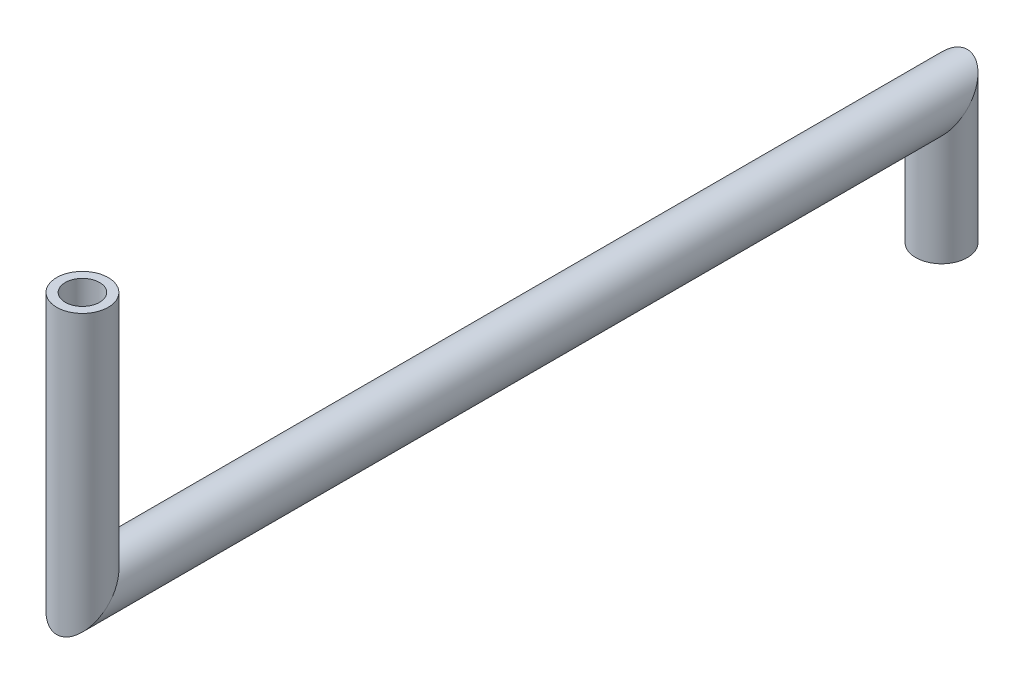
ISO-10303-21;
HEADER;
FILE_DESCRIPTION(('STEP AP214'),'2;1');
FILE_NAME('part.step','',(''),(''),'','','');
FILE_SCHEMA(('AUTOMOTIVE_DESIGN { 1 0 10303 214 1 1 1 1 }'));
ENDSEC;
DATA;
#1=APPLICATION_CONTEXT('core data for automotive mechanical design processes');
#2=APPLICATION_PROTOCOL_DEFINITION('international standard','automotive_design',2000,#1);
#3=PRODUCT_CONTEXT('',#1,'mechanical');
#4=PRODUCT('Part','Part','',(#3));
#5=PRODUCT_RELATED_PRODUCT_CATEGORY('part','',(#4));
#6=PRODUCT_DEFINITION_FORMATION('','',#4);
#7=PRODUCT_DEFINITION_CONTEXT('part definition',#1,'design');
#8=PRODUCT_DEFINITION('design','',#6,#7);
#9=PRODUCT_DEFINITION_SHAPE('','',#8);
#10=(LENGTH_UNIT() NAMED_UNIT(*) SI_UNIT(.MILLI.,.METRE.));
#11=(NAMED_UNIT(*) PLANE_ANGLE_UNIT() SI_UNIT($,.RADIAN.));
#12=(NAMED_UNIT(*) SI_UNIT($,.STERADIAN.) SOLID_ANGLE_UNIT());
#13=UNCERTAINTY_MEASURE_WITH_UNIT(LENGTH_MEASURE(1.E-05),#10,'distance_accuracy_value','');
#14=(GEOMETRIC_REPRESENTATION_CONTEXT(3) GLOBAL_UNCERTAINTY_ASSIGNED_CONTEXT((#13)) GLOBAL_UNIT_ASSIGNED_CONTEXT((#10,
#11,#12)) REPRESENTATION_CONTEXT('',''));
#15=CARTESIAN_POINT('',(0.,0.,0.));
#16=DIRECTION('',(0.,0.,1.));
#17=DIRECTION('',(1.,0.,0.));
#18=AXIS2_PLACEMENT_3D('',#15,#16,#17);
#19=CARTESIAN_POINT('',(0.,233.9,2000.));
#20=DIRECTION('',(0.,1.,0.));
#21=DIRECTION('',(0.,0.,1.));
#22=AXIS2_PLACEMENT_3D('',#19,#20,#21);
#23=CYLINDRICAL_SURFACE('',#22,60.);
#24=CARTESIAN_POINT('',(0.,300.,2000.));
#25=DIRECTION('',(0.,0.707106781186547,0.707106781186548));
#26=DIRECTION('',(0.,-0.707106781186548,0.707106781186547));
#27=AXIS2_PLACEMENT_3D('',#24,#25,#26);
#28=ELLIPSE('',#27,84.8528137423857,60.);
#29=CARTESIAN_POINT('',(0.,240.,2060.));
#30=VERTEX_POINT('',#29);
#31=EDGE_CURVE('E36',#30,#30,#28,.F.);
#32=ORIENTED_EDGE('',*,*,#31,.F.);
#33=EDGE_LOOP('',(#32));
#34=FACE_BOUND('',#33,.T.);
#35=CARTESIAN_POINT('',(0.,900.,2000.));
#36=DIRECTION('',(0.,1.,0.));
#37=DIRECTION('',(0.,0.,1.));
#38=AXIS2_PLACEMENT_3D('',#35,#36,#37);
#39=CIRCLE('',#38,60.);
#40=CARTESIAN_POINT('',(0.,900.,2060.));
#41=VERTEX_POINT('',#40);
#42=EDGE_CURVE('E47',#41,#41,#39,.T.);
#43=ORIENTED_EDGE('',*,*,#42,.F.);
#44=EDGE_LOOP('',(#43));
#45=FACE_BOUND('',#44,.T.);
#46=ADVANCED_FACE('F33',(#34,#45),#23,.T.);
#47=CARTESIAN_POINT('',(0.,300.,-66.1));
#48=DIRECTION('',(0.,0.,1.));
#49=DIRECTION('',(0.,-1.,0.));
#50=AXIS2_PLACEMENT_3D('',#47,#48,#49);
#51=CYLINDRICAL_SURFACE('',#50,60.);
#52=CARTESIAN_POINT('',(0.,300.,0.));
#53=DIRECTION('',(0.,0.707106781186548,0.707106781186548));
#54=DIRECTION('',(0.,0.707106781186548,-0.707106781186548));
#55=AXIS2_PLACEMENT_3D('',#52,#53,#54);
#56=ELLIPSE('',#55,84.8528137423857,60.);
#57=CARTESIAN_POINT('',(0.,360.,-60.));
#58=VERTEX_POINT('',#57);
#59=EDGE_CURVE('E86',#58,#58,#56,.F.);
#60=ORIENTED_EDGE('',*,*,#59,.F.);
#61=EDGE_LOOP('',(#60));
#62=FACE_BOUND('',#61,.T.);
#63=ORIENTED_EDGE('',*,*,#31,.T.);
#64=EDGE_LOOP('',(#63));
#65=FACE_BOUND('',#64,.T.);
#66=ADVANCED_FACE('F90',(#62,#65),#51,.T.);
#67=CARTESIAN_POINT('',(0.,0.,0.));
#68=DIRECTION('',(0.,1.,0.));
#69=DIRECTION('',(0.,0.,1.));
#70=AXIS2_PLACEMENT_3D('',#67,#68,#69);
#71=CYLINDRICAL_SURFACE('',#70,60.);
#72=CARTESIAN_POINT('',(0.,0.,0.));
#73=DIRECTION('',(0.,1.,0.));
#74=DIRECTION('',(0.,0.,1.));
#75=AXIS2_PLACEMENT_3D('',#72,#73,#74);
#76=CIRCLE('',#75,60.);
#77=CARTESIAN_POINT('',(0.,0.,60.));
#78=VERTEX_POINT('',#77);
#79=EDGE_CURVE('E53',#78,#78,#76,.T.);
#80=ORIENTED_EDGE('',*,*,#79,.T.);
#81=EDGE_LOOP('',(#80));
#82=FACE_BOUND('',#81,.T.);
#83=ORIENTED_EDGE('',*,*,#59,.T.);
#84=EDGE_LOOP('',(#83));
#85=FACE_BOUND('',#84,.T.);
#86=ADVANCED_FACE('F92',(#82,#85),#71,.T.);
#87=CARTESIAN_POINT('',(0.,900.,2000.));
#88=DIRECTION('',(0.,1.,0.));
#89=DIRECTION('',(0.,0.,1.));
#90=AXIS2_PLACEMENT_3D('',#87,#88,#89);
#91=PLANE('',#90);
#92=CARTESIAN_POINT('',(0.,900.,2000.));
#93=DIRECTION('',(0.,1.,0.));
#94=DIRECTION('',(0.,0.,1.));
#95=AXIS2_PLACEMENT_3D('',#92,#93,#94);
#96=CIRCLE('',#95,40.);
#97=CARTESIAN_POINT('',(0.,900.,2040.));
#98=VERTEX_POINT('',#97);
#99=EDGE_CURVE('E79',#98,#98,#96,.F.);
#100=ORIENTED_EDGE('',*,*,#99,.T.);
#101=EDGE_LOOP('',(#100));
#102=FACE_BOUND('',#101,.T.);
#103=ORIENTED_EDGE('',*,*,#42,.T.);
#104=EDGE_LOOP('',(#103));
#105=FACE_BOUND('',#104,.T.);
#106=ADVANCED_FACE('F98',(#102,#105),#91,.T.);
#107=CARTESIAN_POINT('',(0.,0.,0.));
#108=DIRECTION('',(0.,1.,0.));
#109=DIRECTION('',(0.,0.,1.));
#110=AXIS2_PLACEMENT_3D('',#107,#108,#109);
#111=PLANE('',#110);
#112=CARTESIAN_POINT('',(0.,0.,0.));
#113=DIRECTION('',(0.,1.,0.));
#114=DIRECTION('',(0.,0.,1.));
#115=AXIS2_PLACEMENT_3D('',#112,#113,#114);
#116=CIRCLE('',#115,40.);
#117=CARTESIAN_POINT('',(0.,0.,40.));
#118=VERTEX_POINT('',#117);
#119=EDGE_CURVE('E41',#118,#118,#116,.F.);
#120=ORIENTED_EDGE('',*,*,#119,.F.);
#121=EDGE_LOOP('',(#120));
#122=FACE_BOUND('',#121,.T.);
#123=ORIENTED_EDGE('',*,*,#79,.F.);
#124=EDGE_LOOP('',(#123));
#125=FACE_BOUND('',#124,.T.);
#126=ADVANCED_FACE('F113',(#122,#125),#111,.F.);
#127=CARTESIAN_POINT('',(0.,255.9,2000.));
#128=DIRECTION('',(0.,1.,0.));
#129=DIRECTION('',(0.,0.,1.));
#130=AXIS2_PLACEMENT_3D('',#127,#128,#129);
#131=CYLINDRICAL_SURFACE('',#130,40.);
#132=CARTESIAN_POINT('',(0.,300.,2000.));
#133=DIRECTION('',(0.,0.707106781186547,0.707106781186548));
#134=DIRECTION('',(0.,-0.707106781186548,0.707106781186547));
#135=AXIS2_PLACEMENT_3D('',#132,#133,#134);
#136=ELLIPSE('',#135,56.5685424949238,40.);
#137=CARTESIAN_POINT('',(0.,260.,2040.));
#138=VERTEX_POINT('',#137);
#139=EDGE_CURVE('E75',#138,#138,#136,.T.);
#140=ORIENTED_EDGE('',*,*,#139,.F.);
#141=EDGE_LOOP('',(#140));
#142=FACE_BOUND('',#141,.T.);
#143=ORIENTED_EDGE('',*,*,#99,.F.);
#144=EDGE_LOOP('',(#143));
#145=FACE_BOUND('',#144,.T.);
#146=ADVANCED_FACE('F76',(#142,#145),#131,.F.);
#147=CARTESIAN_POINT('',(0.,300.,-44.1));
#148=DIRECTION('',(0.,0.,1.));
#149=DIRECTION('',(0.,-1.,0.));
#150=AXIS2_PLACEMENT_3D('',#147,#148,#149);
#151=CYLINDRICAL_SURFACE('',#150,40.);
#152=CARTESIAN_POINT('',(0.,300.,0.));
#153=DIRECTION('',(0.,0.707106781186547,0.707106781186548));
#154=DIRECTION('',(0.,0.707106781186548,-0.707106781186547));
#155=AXIS2_PLACEMENT_3D('',#152,#153,#154);
#156=ELLIPSE('',#155,56.5685424949238,40.);
#157=CARTESIAN_POINT('',(0.,340.,-40.));
#158=VERTEX_POINT('',#157);
#159=EDGE_CURVE('E11',#158,#158,#156,.T.);
#160=ORIENTED_EDGE('',*,*,#159,.F.);
#161=EDGE_LOOP('',(#160));
#162=FACE_BOUND('',#161,.T.);
#163=ORIENTED_EDGE('',*,*,#139,.T.);
#164=EDGE_LOOP('',(#163));
#165=FACE_BOUND('',#164,.T.);
#166=ADVANCED_FACE('F102',(#162,#165),#151,.F.);
#167=CARTESIAN_POINT('',(0.,0.,0.));
#168=DIRECTION('',(0.,1.,0.));
#169=DIRECTION('',(0.,0.,1.));
#170=AXIS2_PLACEMENT_3D('',#167,#168,#169);
#171=CYLINDRICAL_SURFACE('',#170,40.);
#172=ORIENTED_EDGE('',*,*,#119,.T.);
#173=EDGE_LOOP('',(#172));
#174=FACE_BOUND('',#173,.T.);
#175=ORIENTED_EDGE('',*,*,#159,.T.);
#176=EDGE_LOOP('',(#175));
#177=FACE_BOUND('',#176,.T.);
#178=ADVANCED_FACE('F100',(#174,#177),#171,.F.);
#179=CLOSED_SHELL('',(#46,#66,#86,#106,#126,#146,#166,#178));
#180=MANIFOLD_SOLID_BREP('B2',#179);
#181=ADVANCED_BREP_SHAPE_REPRESENTATION('',(#18,#180),#14);
#182=SHAPE_DEFINITION_REPRESENTATION(#9,#181);
ENDSEC;
END-ISO-10303-21;
